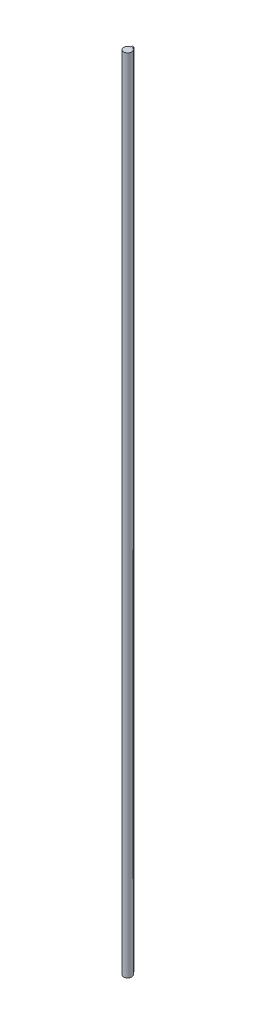
ISO-10303-21;
HEADER;
FILE_DESCRIPTION(('STEP AP214'),'2;1');
FILE_NAME('part.step','',(''),(''),'','','');
FILE_SCHEMA(('AUTOMOTIVE_DESIGN { 1 0 10303 214 1 1 1 1 }'));
ENDSEC;
DATA;
#1=APPLICATION_CONTEXT('core data for automotive mechanical design processes');
#2=APPLICATION_PROTOCOL_DEFINITION('international standard','automotive_design',2000,#1);
#3=PRODUCT_CONTEXT('',#1,'mechanical');
#4=PRODUCT('Part','Part','',(#3));
#5=PRODUCT_RELATED_PRODUCT_CATEGORY('part','',(#4));
#6=PRODUCT_DEFINITION_FORMATION('','',#4);
#7=PRODUCT_DEFINITION_CONTEXT('part definition',#1,'design');
#8=PRODUCT_DEFINITION('design','',#6,#7);
#9=PRODUCT_DEFINITION_SHAPE('','',#8);
#10=(LENGTH_UNIT() NAMED_UNIT(*) SI_UNIT(.MILLI.,.METRE.));
#11=(NAMED_UNIT(*) PLANE_ANGLE_UNIT() SI_UNIT($,.RADIAN.));
#12=(NAMED_UNIT(*) SI_UNIT($,.STERADIAN.) SOLID_ANGLE_UNIT());
#13=UNCERTAINTY_MEASURE_WITH_UNIT(LENGTH_MEASURE(1.E-05),#10,'distance_accuracy_value','');
#14=(GEOMETRIC_REPRESENTATION_CONTEXT(3) GLOBAL_UNCERTAINTY_ASSIGNED_CONTEXT((#13)) GLOBAL_UNIT_ASSIGNED_CONTEXT((#10,
#11,#12)) REPRESENTATION_CONTEXT('',''));
#15=CARTESIAN_POINT('',(0.,0.,0.));
#16=DIRECTION('',(0.,0.,1.));
#17=DIRECTION('',(1.,0.,0.));
#18=AXIS2_PLACEMENT_3D('',#15,#16,#17);
#19=CARTESIAN_POINT('',(0.,2000.,0.));
#20=DIRECTION('',(0.,-1.,0.));
#21=DIRECTION('',(0.,0.,-1.));
#22=AXIS2_PLACEMENT_3D('',#19,#20,#21);
#23=CYLINDRICAL_SURFACE('',#22,10.);
#24=CARTESIAN_POINT('',(0.,0.,0.));
#25=DIRECTION('',(0.,1.,0.));
#26=DIRECTION('',(0.,0.,1.));
#27=AXIS2_PLACEMENT_3D('',#24,#25,#26);
#28=CIRCLE('',#27,10.);
#29=CARTESIAN_POINT('',(-2.,0.,-9.79795897113271));
#30=VERTEX_POINT('',#29);
#31=CARTESIAN_POINT('',(2.,0.,-9.79795897113271));
#32=VERTEX_POINT('',#31);
#33=EDGE_CURVE('E98',#30,#32,#28,.T.);
#34=ORIENTED_EDGE('',*,*,#33,.T.);
#35=DIRECTION('',(0.,-1.,0.));
#36=VECTOR('',#35,1.);
#37=CARTESIAN_POINT('',(2.,2000.,-9.79795897113271));
#38=LINE('',#37,#36);
#39=CARTESIAN_POINT('',(2.,2000.,-9.79795897113271));
#40=VERTEX_POINT('',#39);
#41=EDGE_CURVE('E11',#40,#32,#38,.T.);
#42=ORIENTED_EDGE('',*,*,#41,.F.);
#43=CARTESIAN_POINT('',(0.,2000.,0.));
#44=DIRECTION('',(0.,1.,0.));
#45=DIRECTION('',(0.,0.,1.));
#46=AXIS2_PLACEMENT_3D('',#43,#44,#45);
#47=CIRCLE('',#46,10.);
#48=CARTESIAN_POINT('',(-2.,2000.,-9.79795897113271));
#49=VERTEX_POINT('',#48);
#50=EDGE_CURVE('E86',#49,#40,#47,.T.);
#51=ORIENTED_EDGE('',*,*,#50,.F.);
#52=DIRECTION('',(0.,-1.,0.));
#53=VECTOR('',#52,1.);
#54=CARTESIAN_POINT('',(-2.,2000.,-9.79795897113271));
#55=LINE('',#54,#53);
#56=EDGE_CURVE('E94',#49,#30,#55,.T.);
#57=ORIENTED_EDGE('',*,*,#56,.T.);
#58=EDGE_LOOP('',(#34,#42,#51,#57));
#59=FACE_BOUND('',#58,.T.);
#60=ADVANCED_FACE('F35',(#59),#23,.T.);
#61=CARTESIAN_POINT('',(2.,2000.,-9.79795897113271));
#62=DIRECTION('',(-1.,0.,0.));
#63=DIRECTION('',(0.,0.,1.));
#64=AXIS2_PLACEMENT_3D('',#61,#62,#63);
#65=PLANE('',#64);
#66=DIRECTION('',(0.,0.,-1.));
#67=VECTOR('',#66,1.);
#68=CARTESIAN_POINT('',(2.,0.,-9.79795897113271));
#69=LINE('',#68,#67);
#70=CARTESIAN_POINT('',(2.,0.,-13.7979589711327));
#71=VERTEX_POINT('',#70);
#72=EDGE_CURVE('E90',#32,#71,#69,.T.);
#73=ORIENTED_EDGE('',*,*,#72,.T.);
#74=DIRECTION('',(0.,-1.,0.));
#75=VECTOR('',#74,1.);
#76=CARTESIAN_POINT('',(2.,2000.,-13.7979589711327));
#77=LINE('',#76,#75);
#78=CARTESIAN_POINT('',(2.,2000.,-13.7979589711327));
#79=VERTEX_POINT('',#78);
#80=EDGE_CURVE('E43',#79,#71,#77,.T.);
#81=ORIENTED_EDGE('',*,*,#80,.F.);
#82=DIRECTION('',(0.,0.,-1.));
#83=VECTOR('',#82,1.);
#84=CARTESIAN_POINT('',(2.,2000.,-9.79795897113271));
#85=LINE('',#84,#83);
#86=EDGE_CURVE('E81',#40,#79,#85,.T.);
#87=ORIENTED_EDGE('',*,*,#86,.F.);
#88=ORIENTED_EDGE('',*,*,#41,.T.);
#89=EDGE_LOOP('',(#73,#81,#87,#88));
#90=FACE_BOUND('',#89,.T.);
#91=ADVANCED_FACE('F89',(#90),#65,.F.);
#92=CARTESIAN_POINT('',(-2.,2000.,-13.7979589711327));
#93=DIRECTION('',(0.,0.,1.));
#94=DIRECTION('',(1.,0.,0.));
#95=AXIS2_PLACEMENT_3D('',#92,#93,#94);
#96=PLANE('',#95);
#97=DIRECTION('',(-1.,0.,0.));
#98=VECTOR('',#97,1.);
#99=CARTESIAN_POINT('',(-2.,0.,-13.7979589711327));
#100=LINE('',#99,#98);
#101=CARTESIAN_POINT('',(-2.,0.,-13.7979589711327));
#102=VERTEX_POINT('',#101);
#103=EDGE_CURVE('E68',#71,#102,#100,.T.);
#104=ORIENTED_EDGE('',*,*,#103,.T.);
#105=DIRECTION('',(0.,-1.,0.));
#106=VECTOR('',#105,1.);
#107=CARTESIAN_POINT('',(-2.,2000.,-13.7979589711327));
#108=LINE('',#107,#106);
#109=CARTESIAN_POINT('',(-2.,2000.,-13.7979589711327));
#110=VERTEX_POINT('',#109);
#111=EDGE_CURVE('E91',#110,#102,#108,.T.);
#112=ORIENTED_EDGE('',*,*,#111,.F.);
#113=DIRECTION('',(-1.,0.,0.));
#114=VECTOR('',#113,1.);
#115=CARTESIAN_POINT('',(-2.,2000.,-13.7979589711327));
#116=LINE('',#115,#114);
#117=EDGE_CURVE('E84',#79,#110,#116,.T.);
#118=ORIENTED_EDGE('',*,*,#117,.F.);
#119=ORIENTED_EDGE('',*,*,#80,.T.);
#120=EDGE_LOOP('',(#104,#112,#118,#119));
#121=FACE_BOUND('',#120,.T.);
#122=ADVANCED_FACE('F92',(#121),#96,.F.);
#123=CARTESIAN_POINT('',(-2.,2000.,-9.79795897113271));
#124=DIRECTION('',(1.,0.,0.));
#125=DIRECTION('',(0.,0.,-1.));
#126=AXIS2_PLACEMENT_3D('',#123,#124,#125);
#127=PLANE('',#126);
#128=DIRECTION('',(0.,0.,1.));
#129=VECTOR('',#128,1.);
#130=CARTESIAN_POINT('',(-2.,0.,-9.79795897113271));
#131=LINE('',#130,#129);
#132=EDGE_CURVE('E74',#102,#30,#131,.T.);
#133=ORIENTED_EDGE('',*,*,#132,.T.);
#134=ORIENTED_EDGE('',*,*,#56,.F.);
#135=DIRECTION('',(0.,0.,1.));
#136=VECTOR('',#135,1.);
#137=CARTESIAN_POINT('',(-2.,2000.,-9.79795897113271));
#138=LINE('',#137,#136);
#139=EDGE_CURVE('E51',#110,#49,#138,.T.);
#140=ORIENTED_EDGE('',*,*,#139,.F.);
#141=ORIENTED_EDGE('',*,*,#111,.T.);
#142=EDGE_LOOP('',(#133,#134,#140,#141));
#143=FACE_BOUND('',#142,.T.);
#144=ADVANCED_FACE('F105',(#143),#127,.F.);
#145=CARTESIAN_POINT('',(0.,2000.,0.));
#146=DIRECTION('',(0.,1.,0.));
#147=DIRECTION('',(0.,0.,1.));
#148=AXIS2_PLACEMENT_3D('',#145,#146,#147);
#149=PLANE('',#148);
#150=ORIENTED_EDGE('',*,*,#50,.T.);
#151=ORIENTED_EDGE('',*,*,#86,.T.);
#152=ORIENTED_EDGE('',*,*,#117,.T.);
#153=ORIENTED_EDGE('',*,*,#139,.T.);
#154=EDGE_LOOP('',(#150,#151,#152,#153));
#155=FACE_BOUND('',#154,.T.);
#156=ADVANCED_FACE('F82',(#155),#149,.T.);
#157=CARTESIAN_POINT('',(0.,0.,0.));
#158=DIRECTION('',(0.,1.,0.));
#159=DIRECTION('',(0.,0.,1.));
#160=AXIS2_PLACEMENT_3D('',#157,#158,#159);
#161=PLANE('',#160);
#162=ORIENTED_EDGE('',*,*,#33,.F.);
#163=ORIENTED_EDGE('',*,*,#132,.F.);
#164=ORIENTED_EDGE('',*,*,#103,.F.);
#165=ORIENTED_EDGE('',*,*,#72,.F.);
#166=EDGE_LOOP('',(#162,#163,#164,#165));
#167=FACE_BOUND('',#166,.T.);
#168=ADVANCED_FACE('F108',(#167),#161,.F.);
#169=CLOSED_SHELL('',(#60,#91,#122,#144,#156,#168));
#170=MANIFOLD_SOLID_BREP('B2',#169);
#171=ADVANCED_BREP_SHAPE_REPRESENTATION('',(#18,#170),#14);
#172=SHAPE_DEFINITION_REPRESENTATION(#9,#171);
ENDSEC;
END-ISO-10303-21;
